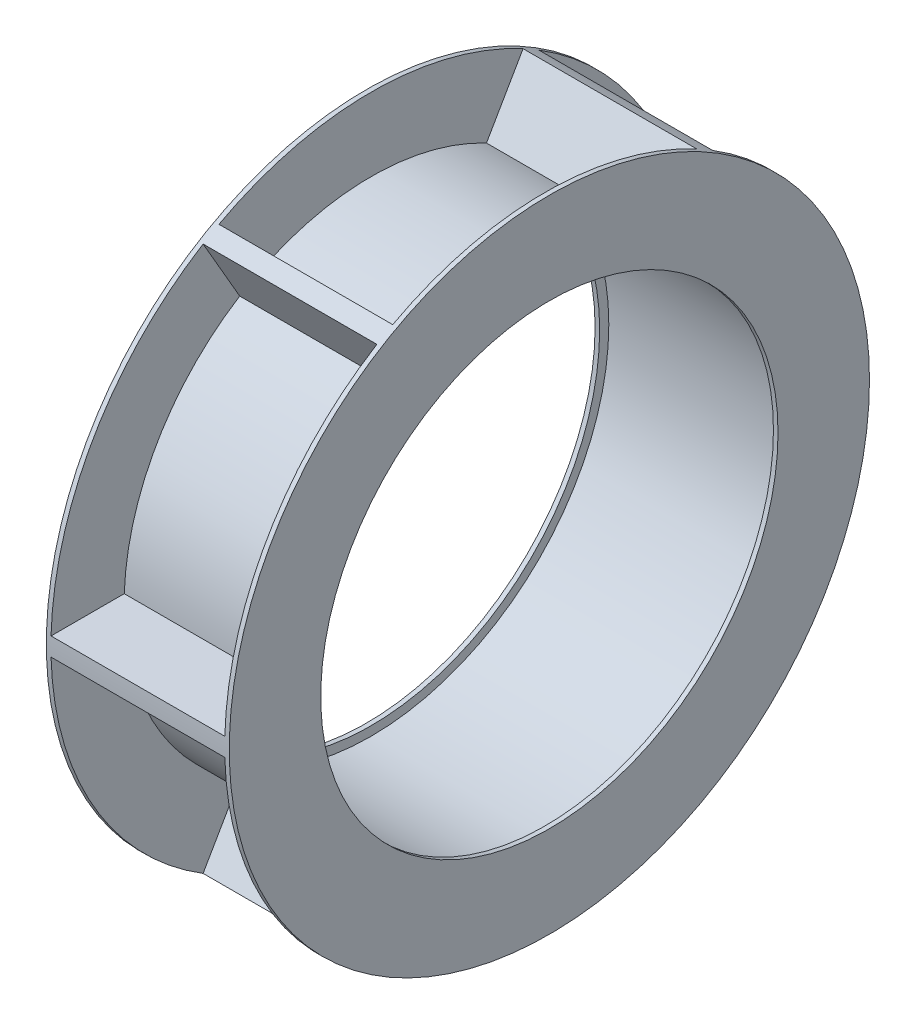
ISO-10303-21;
HEADER;
FILE_DESCRIPTION(('STEP AP214'),'2;1');
FILE_NAME('part.step','',(''),(''),'','','');
FILE_SCHEMA(('AUTOMOTIVE_DESIGN { 1 0 10303 214 1 1 1 1 }'));
ENDSEC;
DATA;
#1=APPLICATION_CONTEXT('core data for automotive mechanical design processes');
#2=APPLICATION_PROTOCOL_DEFINITION('international standard','automotive_design',2000,#1);
#3=PRODUCT_CONTEXT('',#1,'mechanical');
#4=PRODUCT('Part','Part','',(#3));
#5=PRODUCT_RELATED_PRODUCT_CATEGORY('part','',(#4));
#6=PRODUCT_DEFINITION_FORMATION('','',#4);
#7=PRODUCT_DEFINITION_CONTEXT('part definition',#1,'design');
#8=PRODUCT_DEFINITION('design','',#6,#7);
#9=PRODUCT_DEFINITION_SHAPE('','',#8);
#10=(LENGTH_UNIT() NAMED_UNIT(*) SI_UNIT(.MILLI.,.METRE.));
#11=(NAMED_UNIT(*) PLANE_ANGLE_UNIT() SI_UNIT($,.RADIAN.));
#12=(NAMED_UNIT(*) SI_UNIT($,.STERADIAN.) SOLID_ANGLE_UNIT());
#13=UNCERTAINTY_MEASURE_WITH_UNIT(LENGTH_MEASURE(1.E-05),#10,'distance_accuracy_value','');
#14=(GEOMETRIC_REPRESENTATION_CONTEXT(3) GLOBAL_UNCERTAINTY_ASSIGNED_CONTEXT((#13)) GLOBAL_UNIT_ASSIGNED_CONTEXT((#10,
#11,#12)) REPRESENTATION_CONTEXT('',''));
#15=CARTESIAN_POINT('',(0.,0.,0.));
#16=DIRECTION('',(0.,0.,1.));
#17=DIRECTION('',(1.,0.,0.));
#18=AXIS2_PLACEMENT_3D('',#15,#16,#17);
#19=CARTESIAN_POINT('',(-50.,0.,0.));
#20=DIRECTION('',(1.,0.,0.));
#21=DIRECTION('',(0.,0.,-1.));
#22=AXIS2_PLACEMENT_3D('',#19,#20,#21);
#23=CYLINDRICAL_SURFACE('',#22,135.);
#24=DIRECTION('',(1.,0.,0.));
#25=VECTOR('',#24,1.);
#26=CARTESIAN_POINT('',(-50.,114.333214455479,71.7838148350831));
#27=LINE('',#26,#25);
#28=CARTESIAN_POINT('',(-47.5,114.333214455479,71.7838148350831));
#29=VERTEX_POINT('',#28);
#30=CARTESIAN_POINT('',(47.5,114.333214455479,71.7838148350831));
#31=VERTEX_POINT('',#30);
#32=EDGE_CURVE('E451',#29,#31,#27,.T.);
#33=ORIENTED_EDGE('',*,*,#32,.F.);
#34=CARTESIAN_POINT('',(-47.5,0.,0.));
#35=DIRECTION('',(-1.,0.,0.));
#36=DIRECTION('',(0.,0.,1.));
#37=AXIS2_PLACEMENT_3D('',#34,#35,#36);
#38=CIRCLE('',#37,135.);
#39=CARTESIAN_POINT('',(-47.5,5.,134.90737563232));
#40=VERTEX_POINT('',#39);
#41=EDGE_CURVE('E787',#29,#40,#38,.F.);
#42=ORIENTED_EDGE('',*,*,#41,.T.);
#43=DIRECTION('',(1.,0.,0.));
#44=VECTOR('',#43,1.);
#45=CARTESIAN_POINT('',(-50.,5.,134.90737563232));
#46=LINE('',#45,#44);
#47=CARTESIAN_POINT('',(47.5,5.,134.90737563232));
#48=VERTEX_POINT('',#47);
#49=EDGE_CURVE('E483',#40,#48,#46,.T.);
#50=ORIENTED_EDGE('',*,*,#49,.T.);
#51=CARTESIAN_POINT('',(47.5,0.,0.));
#52=DIRECTION('',(1.,0.,0.));
#53=DIRECTION('',(0.,0.,-1.));
#54=AXIS2_PLACEMENT_3D('',#51,#52,#53);
#55=CIRCLE('',#54,135.);
#56=EDGE_CURVE('E746',#48,#31,#55,.F.);
#57=ORIENTED_EDGE('',*,*,#56,.T.);
#58=EDGE_LOOP('',(#33,#42,#50,#57));
#59=FACE_BOUND('',#58,.T.);
#60=ADVANCED_FACE('F239',(#59),#23,.T.);
#61=CARTESIAN_POINT('',(-50.,5.,0.));
#62=DIRECTION('',(0.,-1.,0.));
#63=DIRECTION('',(0.,0.,-1.));
#64=AXIS2_PLACEMENT_3D('',#61,#62,#63);
#65=PLANE('',#64);
#66=DIRECTION('',(0.,0.,-1.));
#67=VECTOR('',#66,1.);
#68=CARTESIAN_POINT('',(-47.5,5.,0.));
#69=LINE('',#68,#67);
#70=CARTESIAN_POINT('',(-47.5,5.,174.928556845359));
#71=VERTEX_POINT('',#70);
#72=EDGE_CURVE('E688',#71,#40,#69,.T.);
#73=ORIENTED_EDGE('',*,*,#72,.F.);
#74=DIRECTION('',(1.,0.,0.));
#75=VECTOR('',#74,1.);
#76=CARTESIAN_POINT('',(-50.,5.,174.928556845359));
#77=LINE('',#76,#75);
#78=CARTESIAN_POINT('',(47.5,5.,174.928556845359));
#79=VERTEX_POINT('',#78);
#80=EDGE_CURVE('E480',#71,#79,#77,.T.);
#81=ORIENTED_EDGE('',*,*,#80,.T.);
#82=DIRECTION('',(0.,0.,1.));
#83=VECTOR('',#82,1.);
#84=CARTESIAN_POINT('',(47.5,5.,0.));
#85=LINE('',#84,#83);
#86=EDGE_CURVE('E750',#48,#79,#85,.T.);
#87=ORIENTED_EDGE('',*,*,#86,.F.);
#88=ORIENTED_EDGE('',*,*,#49,.F.);
#89=EDGE_LOOP('',(#73,#81,#87,#88));
#90=FACE_BOUND('',#89,.T.);
#91=ADVANCED_FACE('F563',(#90),#65,.F.);
#92=CARTESIAN_POINT('',(-50.,-2.50000000000044,4.33012701892296));
#93=DIRECTION('',(0.,-0.499999999999999,0.866025403784439));
#94=DIRECTION('',(0.,-0.866025403784439,-0.499999999999999));
#95=AXIS2_PLACEMENT_3D('',#92,#93,#94);
#96=PLANE('',#95);
#97=DIRECTION('',(1.,0.,0.));
#98=VECTOR('',#97,1.);
#99=CARTESIAN_POINT('',(-50.,148.992574075431,91.7944054416023));
#100=LINE('',#99,#98);
#101=CARTESIAN_POINT('',(-47.5,148.992574075431,91.7944054416023));
#102=VERTEX_POINT('',#101);
#103=CARTESIAN_POINT('',(47.5,148.992574075431,91.7944054416023));
#104=VERTEX_POINT('',#103);
#105=EDGE_CURVE('E484',#102,#104,#100,.T.);
#106=ORIENTED_EDGE('',*,*,#105,.F.);
#107=DIRECTION('',(0.,-0.866025403784439,-0.499999999999999));
#108=VECTOR('',#107,1.);
#109=CARTESIAN_POINT('',(-47.5,-2.50000000000044,4.33012701892296));
#110=LINE('',#109,#108);
#111=EDGE_CURVE('E791',#102,#29,#110,.T.);
#112=ORIENTED_EDGE('',*,*,#111,.T.);
#113=ORIENTED_EDGE('',*,*,#32,.T.);
#114=DIRECTION('',(0.,0.866025403784439,0.499999999999999));
#115=VECTOR('',#114,1.);
#116=CARTESIAN_POINT('',(47.5,-2.50000000000044,4.33012701892296));
#117=LINE('',#116,#115);
#118=EDGE_CURVE('E742',#31,#104,#117,.T.);
#119=ORIENTED_EDGE('',*,*,#118,.T.);
#120=EDGE_LOOP('',(#106,#112,#113,#119));
#121=FACE_BOUND('',#120,.T.);
#122=ADVANCED_FACE('F570',(#121),#96,.T.);
#123=CARTESIAN_POINT('',(-50.,0.,0.));
#124=DIRECTION('',(1.,0.,0.));
#125=DIRECTION('',(0.,0.,-1.));
#126=AXIS2_PLACEMENT_3D('',#123,#124,#125);
#127=CYLINDRICAL_SURFACE('',#126,135.);
#128=DIRECTION('',(1.,0.,0.));
#129=VECTOR('',#128,1.);
#130=CARTESIAN_POINT('',(-50.,-5.,134.90737563232));
#131=LINE('',#130,#129);
#132=CARTESIAN_POINT('',(-47.5,-5.,134.90737563232));
#133=VERTEX_POINT('',#132);
#134=CARTESIAN_POINT('',(47.5,-5.,134.90737563232));
#135=VERTEX_POINT('',#134);
#136=EDGE_CURVE('E754',#133,#135,#131,.T.);
#137=ORIENTED_EDGE('',*,*,#136,.F.);
#138=CARTESIAN_POINT('',(-47.5,0.,0.));
#139=DIRECTION('',(-1.,0.,0.));
#140=DIRECTION('',(0.,0.,1.));
#141=AXIS2_PLACEMENT_3D('',#138,#139,#140);
#142=CIRCLE('',#141,135.);
#143=CARTESIAN_POINT('',(-47.5,-114.333214455479,71.7838148350826));
#144=VERTEX_POINT('',#143);
#145=EDGE_CURVE('E800',#133,#144,#142,.F.);
#146=ORIENTED_EDGE('',*,*,#145,.T.);
#147=DIRECTION('',(1.,0.,0.));
#148=VECTOR('',#147,1.);
#149=CARTESIAN_POINT('',(-50.,-114.333214455479,71.7838148350827));
#150=LINE('',#149,#148);
#151=CARTESIAN_POINT('',(47.5,-114.333214455479,71.7838148350826));
#152=VERTEX_POINT('',#151);
#153=EDGE_CURVE('E467',#144,#152,#150,.T.);
#154=ORIENTED_EDGE('',*,*,#153,.T.);
#155=CARTESIAN_POINT('',(47.5,0.,0.));
#156=DIRECTION('',(1.,0.,0.));
#157=DIRECTION('',(0.,0.,-1.));
#158=AXIS2_PLACEMENT_3D('',#155,#156,#157);
#159=CIRCLE('',#158,135.);
#160=EDGE_CURVE('E734',#152,#135,#159,.F.);
#161=ORIENTED_EDGE('',*,*,#160,.T.);
#162=EDGE_LOOP('',(#137,#146,#154,#161));
#163=FACE_BOUND('',#162,.T.);
#164=ADVANCED_FACE('F576',(#163),#127,.T.);
#165=CARTESIAN_POINT('',(-50.,2.50000000000021,4.33012701892256));
#166=DIRECTION('',(0.,-0.499999999999999,-0.866025403784439));
#167=DIRECTION('',(0.,0.866025403784439,-0.499999999999999));
#168=AXIS2_PLACEMENT_3D('',#165,#166,#167);
#169=PLANE('',#168);
#170=DIRECTION('',(0.,0.866025403784439,-0.499999999999999));
#171=VECTOR('',#170,1.);
#172=CARTESIAN_POINT('',(-47.5,2.50000000000021,4.33012701892256));
#173=LINE('',#172,#171);
#174=CARTESIAN_POINT('',(-47.5,-148.992574075431,91.7944054416019));
#175=VERTEX_POINT('',#174);
#176=EDGE_CURVE('E795',#175,#144,#173,.T.);
#177=ORIENTED_EDGE('',*,*,#176,.F.);
#178=DIRECTION('',(1.,0.,0.));
#179=VECTOR('',#178,1.);
#180=CARTESIAN_POINT('',(-50.,-148.992574075431,91.7944054416019));
#181=LINE('',#180,#179);
#182=CARTESIAN_POINT('',(47.5,-148.992574075431,91.7944054416019));
#183=VERTEX_POINT('',#182);
#184=EDGE_CURVE('E755',#175,#183,#181,.T.);
#185=ORIENTED_EDGE('',*,*,#184,.T.);
#186=DIRECTION('',(0.,-0.866025403784439,0.499999999999999));
#187=VECTOR('',#186,1.);
#188=CARTESIAN_POINT('',(47.5,2.50000000000021,4.33012701892256));
#189=LINE('',#188,#187);
#190=EDGE_CURVE('E738',#152,#183,#189,.T.);
#191=ORIENTED_EDGE('',*,*,#190,.F.);
#192=ORIENTED_EDGE('',*,*,#153,.F.);
#193=EDGE_LOOP('',(#177,#185,#191,#192));
#194=FACE_BOUND('',#193,.T.);
#195=ADVANCED_FACE('F627',(#194),#169,.F.);
#196=CARTESIAN_POINT('',(-50.,-5.,0.));
#197=DIRECTION('',(0.,-1.,0.));
#198=DIRECTION('',(0.,0.,-1.));
#199=AXIS2_PLACEMENT_3D('',#196,#197,#198);
#200=PLANE('',#199);
#201=DIRECTION('',(1.,0.,0.));
#202=VECTOR('',#201,1.);
#203=CARTESIAN_POINT('',(-50.,-5.,174.928556845359));
#204=LINE('',#203,#202);
#205=CARTESIAN_POINT('',(-47.5,-5.,174.928556845359));
#206=VERTEX_POINT('',#205);
#207=CARTESIAN_POINT('',(47.5,-5.,174.928556845359));
#208=VERTEX_POINT('',#207);
#209=EDGE_CURVE('E438',#206,#208,#204,.T.);
#210=ORIENTED_EDGE('',*,*,#209,.F.);
#211=DIRECTION('',(0.,0.,-1.));
#212=VECTOR('',#211,1.);
#213=CARTESIAN_POINT('',(-47.5,-5.,0.));
#214=LINE('',#213,#212);
#215=EDGE_CURVE('E804',#206,#133,#214,.T.);
#216=ORIENTED_EDGE('',*,*,#215,.T.);
#217=ORIENTED_EDGE('',*,*,#136,.T.);
#218=DIRECTION('',(0.,0.,1.));
#219=VECTOR('',#218,1.);
#220=CARTESIAN_POINT('',(47.5,-5.,0.));
#221=LINE('',#220,#219);
#222=EDGE_CURVE('E730',#135,#208,#221,.T.);
#223=ORIENTED_EDGE('',*,*,#222,.T.);
#224=EDGE_LOOP('',(#210,#216,#217,#223));
#225=FACE_BOUND('',#224,.T.);
#226=ADVANCED_FACE('F583',(#225),#200,.T.);
#227=CARTESIAN_POINT('',(-50.,0.,0.));
#228=DIRECTION('',(1.,0.,0.));
#229=DIRECTION('',(0.,0.,-1.));
#230=AXIS2_PLACEMENT_3D('',#227,#228,#229);
#231=CYLINDRICAL_SURFACE('',#230,135.);
#232=DIRECTION('',(1.,0.,0.));
#233=VECTOR('',#232,1.);
#234=CARTESIAN_POINT('',(-50.,-114.333214455479,-71.7838148350824));
#235=LINE('',#234,#233);
#236=CARTESIAN_POINT('',(-47.5,-114.333214455479,-71.7838148350824));
#237=VERTEX_POINT('',#236);
#238=CARTESIAN_POINT('',(47.5,-114.333214455479,-71.7838148350824));
#239=VERTEX_POINT('',#238);
#240=EDGE_CURVE('E463',#237,#239,#235,.T.);
#241=ORIENTED_EDGE('',*,*,#240,.F.);
#242=CARTESIAN_POINT('',(-47.5,0.,0.));
#243=DIRECTION('',(-1.,0.,0.));
#244=DIRECTION('',(0.,0.,1.));
#245=AXIS2_PLACEMENT_3D('',#242,#243,#244);
#246=CIRCLE('',#245,135.);
#247=CARTESIAN_POINT('',(-47.5,-4.99999999999928,-134.90737563232));
#248=VERTEX_POINT('',#247);
#249=EDGE_CURVE('E810',#237,#248,#246,.F.);
#250=ORIENTED_EDGE('',*,*,#249,.T.);
#251=DIRECTION('',(1.,0.,0.));
#252=VECTOR('',#251,1.);
#253=CARTESIAN_POINT('',(-50.,-4.99999999999928,-134.90737563232));
#254=LINE('',#253,#252);
#255=CARTESIAN_POINT('',(47.5,-4.99999999999928,-134.90737563232));
#256=VERTEX_POINT('',#255);
#257=EDGE_CURVE('E442',#248,#256,#254,.T.);
#258=ORIENTED_EDGE('',*,*,#257,.T.);
#259=CARTESIAN_POINT('',(47.5,0.,0.));
#260=DIRECTION('',(1.,0.,0.));
#261=DIRECTION('',(0.,0.,-1.));
#262=AXIS2_PLACEMENT_3D('',#259,#260,#261);
#263=CIRCLE('',#262,135.);
#264=EDGE_CURVE('E722',#256,#239,#263,.F.);
#265=ORIENTED_EDGE('',*,*,#264,.T.);
#266=EDGE_LOOP('',(#241,#250,#258,#265));
#267=FACE_BOUND('',#266,.T.);
#268=ADVANCED_FACE('F579',(#267),#231,.T.);
#269=CARTESIAN_POINT('',(-50.,-4.99999999999929,0.));
#270=DIRECTION('',(0.,1.,0.));
#271=DIRECTION('',(0.,0.,1.));
#272=AXIS2_PLACEMENT_3D('',#269,#270,#271);
#273=PLANE('',#272);
#274=DIRECTION('',(0.,0.,1.));
#275=VECTOR('',#274,1.);
#276=CARTESIAN_POINT('',(-47.5,-4.99999999999929,0.));
#277=LINE('',#276,#275);
#278=CARTESIAN_POINT('',(-47.5,-4.99999999999927,-174.928556845359));
#279=VERTEX_POINT('',#278);
#280=EDGE_CURVE('E807',#279,#248,#277,.T.);
#281=ORIENTED_EDGE('',*,*,#280,.F.);
#282=DIRECTION('',(1.,0.,0.));
#283=VECTOR('',#282,1.);
#284=CARTESIAN_POINT('',(-50.,-4.99999999999927,-174.928556845359));
#285=LINE('',#284,#283);
#286=CARTESIAN_POINT('',(47.5,-4.99999999999927,-174.928556845359));
#287=VERTEX_POINT('',#286);
#288=EDGE_CURVE('E470',#279,#287,#285,.T.);
#289=ORIENTED_EDGE('',*,*,#288,.T.);
#290=DIRECTION('',(0.,0.,-1.));
#291=VECTOR('',#290,1.);
#292=CARTESIAN_POINT('',(47.5,-4.99999999999929,0.));
#293=LINE('',#292,#291);
#294=EDGE_CURVE('E726',#256,#287,#293,.T.);
#295=ORIENTED_EDGE('',*,*,#294,.F.);
#296=ORIENTED_EDGE('',*,*,#257,.F.);
#297=EDGE_LOOP('',(#281,#289,#295,#296));
#298=FACE_BOUND('',#297,.T.);
#299=ADVANCED_FACE('F582',(#298),#273,.F.);
#300=CARTESIAN_POINT('',(-50.,2.49999999999997,-4.33012701892213));
#301=DIRECTION('',(0.,0.500000000000001,-0.866025403784438));
#302=DIRECTION('',(0.,0.866025403784438,0.500000000000001));
#303=AXIS2_PLACEMENT_3D('',#300,#301,#302);
#304=PLANE('',#303);
#305=DIRECTION('',(1.,0.,0.));
#306=VECTOR('',#305,1.);
#307=CARTESIAN_POINT('',(-50.,-148.992574075431,-91.7944054416017));
#308=LINE('',#307,#306);
#309=CARTESIAN_POINT('',(-47.5,-148.992574075431,-91.7944054416017));
#310=VERTEX_POINT('',#309);
#311=CARTESIAN_POINT('',(47.5,-148.992574075431,-91.7944054416017));
#312=VERTEX_POINT('',#311);
#313=EDGE_CURVE('E473',#310,#312,#308,.T.);
#314=ORIENTED_EDGE('',*,*,#313,.F.);
#315=DIRECTION('',(0.,0.866025403784438,0.500000000000001));
#316=VECTOR('',#315,1.);
#317=CARTESIAN_POINT('',(-47.5,2.49999999999997,-4.33012701892213));
#318=LINE('',#317,#316);
#319=EDGE_CURVE('E814',#310,#237,#318,.T.);
#320=ORIENTED_EDGE('',*,*,#319,.T.);
#321=ORIENTED_EDGE('',*,*,#240,.T.);
#322=DIRECTION('',(0.,-0.866025403784438,-0.500000000000001));
#323=VECTOR('',#322,1.);
#324=CARTESIAN_POINT('',(47.5,2.49999999999997,-4.33012701892213));
#325=LINE('',#324,#323);
#326=EDGE_CURVE('E718',#239,#312,#325,.T.);
#327=ORIENTED_EDGE('',*,*,#326,.T.);
#328=EDGE_LOOP('',(#314,#320,#321,#327));
#329=FACE_BOUND('',#328,.T.);
#330=ADVANCED_FACE('F585',(#329),#304,.T.);
#331=CARTESIAN_POINT('',(-50.,0.,0.));
#332=DIRECTION('',(1.,0.,0.));
#333=DIRECTION('',(0.,0.,-1.));
#334=AXIS2_PLACEMENT_3D('',#331,#332,#333);
#335=CYLINDRICAL_SURFACE('',#334,135.);
#336=DIRECTION('',(1.,0.,0.));
#337=VECTOR('',#336,1.);
#338=CARTESIAN_POINT('',(-50.,-119.333214455479,63.1235607972383));
#339=LINE('',#338,#337);
#340=CARTESIAN_POINT('',(-47.5,-119.333214455479,63.1235607972383));
#341=VERTEX_POINT('',#340);
#342=CARTESIAN_POINT('',(47.5,-119.333214455479,63.1235607972383));
#343=VERTEX_POINT('',#342);
#344=EDGE_CURVE('E464',#341,#343,#339,.T.);
#345=ORIENTED_EDGE('',*,*,#344,.F.);
#346=CARTESIAN_POINT('',(-47.5,0.,0.));
#347=DIRECTION('',(-1.,0.,0.));
#348=DIRECTION('',(0.,0.,1.));
#349=AXIS2_PLACEMENT_3D('',#346,#347,#348);
#350=CIRCLE('',#349,135.);
#351=CARTESIAN_POINT('',(-47.5,-119.333214455479,-63.1235607972381));
#352=VERTEX_POINT('',#351);
#353=EDGE_CURVE('E821',#341,#352,#350,.F.);
#354=ORIENTED_EDGE('',*,*,#353,.T.);
#355=DIRECTION('',(1.,0.,0.));
#356=VECTOR('',#355,1.);
#357=CARTESIAN_POINT('',(-50.,-119.333214455479,-63.1235607972381));
#358=LINE('',#357,#356);
#359=CARTESIAN_POINT('',(47.5,-119.333214455479,-63.1235607972381));
#360=VERTEX_POINT('',#359);
#361=EDGE_CURVE('E459',#352,#360,#358,.T.);
#362=ORIENTED_EDGE('',*,*,#361,.T.);
#363=CARTESIAN_POINT('',(47.5,0.,0.));
#364=DIRECTION('',(1.,0.,0.));
#365=DIRECTION('',(0.,0.,-1.));
#366=AXIS2_PLACEMENT_3D('',#363,#364,#365);
#367=CIRCLE('',#366,135.);
#368=EDGE_CURVE('E710',#360,#343,#367,.F.);
#369=ORIENTED_EDGE('',*,*,#368,.T.);
#370=EDGE_LOOP('',(#345,#354,#362,#369));
#371=FACE_BOUND('',#370,.T.);
#372=ADVANCED_FACE('F588',(#371),#335,.T.);
#373=CARTESIAN_POINT('',(-50.,-2.50000000000003,4.33012701892223));
#374=DIRECTION('',(0.,0.500000000000001,-0.866025403784438));
#375=DIRECTION('',(0.,0.866025403784438,0.500000000000001));
#376=AXIS2_PLACEMENT_3D('',#373,#374,#375);
#377=PLANE('',#376);
#378=DIRECTION('',(0.,0.866025403784438,0.500000000000001));
#379=VECTOR('',#378,1.);
#380=CARTESIAN_POINT('',(-47.5,-2.50000000000003,4.33012701892223));
#381=LINE('',#380,#379);
#382=CARTESIAN_POINT('',(-47.5,-153.992574075431,-83.1341514037574));
#383=VERTEX_POINT('',#382);
#384=EDGE_CURVE('E818',#383,#352,#381,.T.);
#385=ORIENTED_EDGE('',*,*,#384,.F.);
#386=DIRECTION('',(1.,0.,0.));
#387=VECTOR('',#386,1.);
#388=CARTESIAN_POINT('',(-50.,-153.992574075431,-83.1341514037574));
#389=LINE('',#388,#387);
#390=CARTESIAN_POINT('',(47.5,-153.992574075431,-83.1341514037574));
#391=VERTEX_POINT('',#390);
#392=EDGE_CURVE('E456',#383,#391,#389,.T.);
#393=ORIENTED_EDGE('',*,*,#392,.T.);
#394=DIRECTION('',(0.,-0.866025403784438,-0.500000000000001));
#395=VECTOR('',#394,1.);
#396=CARTESIAN_POINT('',(47.5,-2.50000000000003,4.33012701892223));
#397=LINE('',#396,#395);
#398=EDGE_CURVE('E714',#360,#391,#397,.T.);
#399=ORIENTED_EDGE('',*,*,#398,.F.);
#400=ORIENTED_EDGE('',*,*,#361,.F.);
#401=EDGE_LOOP('',(#385,#393,#399,#400));
#402=FACE_BOUND('',#401,.T.);
#403=ADVANCED_FACE('F595',(#402),#377,.F.);
#404=CARTESIAN_POINT('',(-50.,-2.4999999999998,-4.33012701892186));
#405=DIRECTION('',(0.,-0.499999999999999,-0.866025403784439));
#406=DIRECTION('',(0.,0.866025403784439,-0.499999999999999));
#407=AXIS2_PLACEMENT_3D('',#404,#405,#406);
#408=PLANE('',#407);
#409=DIRECTION('',(1.,0.,0.));
#410=VECTOR('',#409,1.);
#411=CARTESIAN_POINT('',(-50.,-153.992574075431,83.1341514037575));
#412=LINE('',#411,#410);
#413=CARTESIAN_POINT('',(-47.5,-153.992574075431,83.1341514037575));
#414=VERTEX_POINT('',#413);
#415=CARTESIAN_POINT('',(47.5,-153.992574075431,83.1341514037575));
#416=VERTEX_POINT('',#415);
#417=EDGE_CURVE('E460',#414,#416,#412,.T.);
#418=ORIENTED_EDGE('',*,*,#417,.F.);
#419=DIRECTION('',(0.,0.866025403784439,-0.499999999999999));
#420=VECTOR('',#419,1.);
#421=CARTESIAN_POINT('',(-47.5,-2.4999999999998,-4.33012701892186));
#422=LINE('',#421,#420);
#423=EDGE_CURVE('E668',#414,#341,#422,.T.);
#424=ORIENTED_EDGE('',*,*,#423,.T.);
#425=ORIENTED_EDGE('',*,*,#344,.T.);
#426=DIRECTION('',(0.,-0.866025403784439,0.499999999999999));
#427=VECTOR('',#426,1.);
#428=CARTESIAN_POINT('',(47.5,-2.4999999999998,-4.33012701892186));
#429=LINE('',#428,#427);
#430=EDGE_CURVE('E706',#343,#416,#429,.T.);
#431=ORIENTED_EDGE('',*,*,#430,.T.);
#432=EDGE_LOOP('',(#418,#424,#425,#431));
#433=FACE_BOUND('',#432,.T.);
#434=ADVANCED_FACE('F597',(#433),#408,.T.);
#435=CARTESIAN_POINT('',(-50.,0.,0.));
#436=DIRECTION('',(1.,0.,0.));
#437=DIRECTION('',(0.,0.,-1.));
#438=AXIS2_PLACEMENT_3D('',#435,#436,#437);
#439=CYLINDRICAL_SURFACE('',#438,135.);
#440=DIRECTION('',(1.,0.,0.));
#441=VECTOR('',#440,1.);
#442=CARTESIAN_POINT('',(-50.,119.33321445548,-63.123560797237));
#443=LINE('',#442,#441);
#444=CARTESIAN_POINT('',(-47.5,119.33321445548,-63.123560797237));
#445=VERTEX_POINT('',#444);
#446=CARTESIAN_POINT('',(47.5,119.33321445548,-63.123560797237));
#447=VERTEX_POINT('',#446);
#448=EDGE_CURVE('E433',#445,#447,#443,.T.);
#449=ORIENTED_EDGE('',*,*,#448,.F.);
#450=CARTESIAN_POINT('',(-47.5,0.,0.));
#451=DIRECTION('',(-1.,0.,0.));
#452=DIRECTION('',(0.,0.,1.));
#453=AXIS2_PLACEMENT_3D('',#450,#451,#452);
#454=CIRCLE('',#453,135.);
#455=CARTESIAN_POINT('',(-47.5,119.333214455479,63.1235607972387));
#456=VERTEX_POINT('',#455);
#457=EDGE_CURVE('E669',#445,#456,#454,.F.);
#458=ORIENTED_EDGE('',*,*,#457,.T.);
#459=DIRECTION('',(1.,0.,0.));
#460=VECTOR('',#459,1.);
#461=CARTESIAN_POINT('',(-50.,119.333214455479,63.1235607972387));
#462=LINE('',#461,#460);
#463=CARTESIAN_POINT('',(47.5,119.333214455479,63.1235607972387));
#464=VERTEX_POINT('',#463);
#465=EDGE_CURVE('E447',#456,#464,#462,.T.);
#466=ORIENTED_EDGE('',*,*,#465,.T.);
#467=CARTESIAN_POINT('',(47.5,0.,0.));
#468=DIRECTION('',(1.,0.,0.));
#469=DIRECTION('',(0.,0.,-1.));
#470=AXIS2_PLACEMENT_3D('',#467,#468,#469);
#471=CIRCLE('',#470,135.);
#472=EDGE_CURVE('E699',#464,#447,#471,.F.);
#473=ORIENTED_EDGE('',*,*,#472,.T.);
#474=EDGE_LOOP('',(#449,#458,#466,#473));
#475=FACE_BOUND('',#474,.T.);
#476=ADVANCED_FACE('F600',(#475),#439,.T.);
#477=CARTESIAN_POINT('',(-50.,2.4999999999996,-4.3301270189215));
#478=DIRECTION('',(0.,-0.5,0.866025403784439));
#479=DIRECTION('',(0.,-0.866025403784439,-0.5));
#480=AXIS2_PLACEMENT_3D('',#477,#478,#479);
#481=PLANE('',#480);
#482=DIRECTION('',(0.,-0.866025403784439,-0.5));
#483=VECTOR('',#482,1.);
#484=CARTESIAN_POINT('',(-47.5,2.4999999999996,-4.3301270189215));
#485=LINE('',#484,#483);
#486=CARTESIAN_POINT('',(-47.5,153.992574075431,83.134151403758));
#487=VERTEX_POINT('',#486);
#488=EDGE_CURVE('E659',#487,#456,#485,.T.);
#489=ORIENTED_EDGE('',*,*,#488,.F.);
#490=DIRECTION('',(1.,0.,0.));
#491=VECTOR('',#490,1.);
#492=CARTESIAN_POINT('',(-50.,153.992574075431,83.1341514037579));
#493=LINE('',#492,#491);
#494=CARTESIAN_POINT('',(47.5,153.992574075431,83.1341514037579));
#495=VERTEX_POINT('',#494);
#496=EDGE_CURVE('E444',#487,#495,#493,.T.);
#497=ORIENTED_EDGE('',*,*,#496,.T.);
#498=DIRECTION('',(0.,0.866025403784439,0.5));
#499=VECTOR('',#498,1.);
#500=CARTESIAN_POINT('',(47.5,2.4999999999996,-4.3301270189215));
#501=LINE('',#500,#499);
#502=EDGE_CURVE('E703',#464,#495,#501,.T.);
#503=ORIENTED_EDGE('',*,*,#502,.F.);
#504=ORIENTED_EDGE('',*,*,#465,.F.);
#505=EDGE_LOOP('',(#489,#497,#503,#504));
#506=FACE_BOUND('',#505,.T.);
#507=ADVANCED_FACE('F607',(#506),#481,.F.);
#508=CARTESIAN_POINT('',(-50.,2.50000000000056,4.33012701892317));
#509=DIRECTION('',(0.,0.5,0.866025403784439));
#510=DIRECTION('',(0.,-0.866025403784439,0.5));
#511=AXIS2_PLACEMENT_3D('',#508,#509,#510);
#512=PLANE('',#511);
#513=DIRECTION('',(1.,0.,0.));
#514=VECTOR('',#513,1.);
#515=CARTESIAN_POINT('',(-50.,153.992574075432,-83.1341514037563));
#516=LINE('',#515,#514);
#517=CARTESIAN_POINT('',(-47.5,153.992574075432,-83.1341514037563));
#518=VERTEX_POINT('',#517);
#519=CARTESIAN_POINT('',(47.5,153.992574075432,-83.1341514037563));
#520=VERTEX_POINT('',#519);
#521=EDGE_CURVE('E448',#518,#520,#516,.T.);
#522=ORIENTED_EDGE('',*,*,#521,.F.);
#523=DIRECTION('',(0.,-0.866025403784439,0.5));
#524=VECTOR('',#523,1.);
#525=CARTESIAN_POINT('',(-47.5,2.50000000000056,4.33012701892317));
#526=LINE('',#525,#524);
#527=EDGE_CURVE('E421',#518,#445,#526,.T.);
#528=ORIENTED_EDGE('',*,*,#527,.T.);
#529=ORIENTED_EDGE('',*,*,#448,.T.);
#530=DIRECTION('',(0.,0.866025403784439,-0.5));
#531=VECTOR('',#530,1.);
#532=CARTESIAN_POINT('',(47.5,2.50000000000056,4.33012701892317));
#533=LINE('',#532,#531);
#534=EDGE_CURVE('E696',#447,#520,#533,.T.);
#535=ORIENTED_EDGE('',*,*,#534,.T.);
#536=EDGE_LOOP('',(#522,#528,#529,#535));
#537=FACE_BOUND('',#536,.T.);
#538=ADVANCED_FACE('F609',(#537),#512,.T.);
#539=CARTESIAN_POINT('',(-50.,0.,0.));
#540=DIRECTION('',(1.,0.,0.));
#541=DIRECTION('',(0.,0.,-1.));
#542=AXIS2_PLACEMENT_3D('',#539,#540,#541);
#543=CYLINDRICAL_SURFACE('',#542,135.);
#544=DIRECTION('',(1.,0.,0.));
#545=VECTOR('',#544,1.);
#546=CARTESIAN_POINT('',(-50.,5.00000000000072,-134.90737563232));
#547=LINE('',#546,#545);
#548=CARTESIAN_POINT('',(-47.5,5.00000000000072,-134.90737563232));
#549=VERTEX_POINT('',#548);
#550=CARTESIAN_POINT('',(47.5,5.00000000000072,-134.90737563232));
#551=VERTEX_POINT('',#550);
#552=EDGE_CURVE('E435',#549,#551,#547,.T.);
#553=ORIENTED_EDGE('',*,*,#552,.F.);
#554=CARTESIAN_POINT('',(-47.5,0.,0.));
#555=DIRECTION('',(-1.,0.,0.));
#556=DIRECTION('',(0.,0.,1.));
#557=AXIS2_PLACEMENT_3D('',#554,#555,#556);
#558=CIRCLE('',#557,135.);
#559=CARTESIAN_POINT('',(-47.5,114.33321445548,-71.7838148350815));
#560=VERTEX_POINT('',#559);
#561=EDGE_CURVE('E422',#549,#560,#558,.F.);
#562=ORIENTED_EDGE('',*,*,#561,.T.);
#563=DIRECTION('',(1.,0.,0.));
#564=VECTOR('',#563,1.);
#565=CARTESIAN_POINT('',(-50.,114.33321445548,-71.7838148350815));
#566=LINE('',#565,#564);
#567=CARTESIAN_POINT('',(47.5,114.33321445548,-71.7838148350815));
#568=VERTEX_POINT('',#567);
#569=EDGE_CURVE('E419',#560,#568,#566,.T.);
#570=ORIENTED_EDGE('',*,*,#569,.T.);
#571=CARTESIAN_POINT('',(47.5,0.,0.));
#572=DIRECTION('',(1.,0.,0.));
#573=DIRECTION('',(0.,0.,-1.));
#574=AXIS2_PLACEMENT_3D('',#571,#572,#573);
#575=CIRCLE('',#574,135.);
#576=EDGE_CURVE('E682',#568,#551,#575,.F.);
#577=ORIENTED_EDGE('',*,*,#576,.T.);
#578=EDGE_LOOP('',(#553,#562,#570,#577));
#579=FACE_BOUND('',#578,.T.);
#580=ADVANCED_FACE('F612',(#579),#543,.T.);
#581=CARTESIAN_POINT('',(-50.,-2.49999999999943,-4.3301270189212));
#582=DIRECTION('',(0.,0.5,0.866025403784438));
#583=DIRECTION('',(0.,-0.866025403784439,0.5));
#584=AXIS2_PLACEMENT_3D('',#581,#582,#583);
#585=PLANE('',#584);
#586=DIRECTION('',(0.,-0.866025403784439,0.5));
#587=VECTOR('',#586,1.);
#588=CARTESIAN_POINT('',(-47.5,-2.49999999999943,-4.3301270189212));
#589=LINE('',#588,#587);
#590=CARTESIAN_POINT('',(-47.5,148.992574075432,-91.7944054416007));
#591=VERTEX_POINT('',#590);
#592=EDGE_CURVE('E403',#591,#560,#589,.T.);
#593=ORIENTED_EDGE('',*,*,#592,.F.);
#594=DIRECTION('',(1.,0.,0.));
#595=VECTOR('',#594,1.);
#596=CARTESIAN_POINT('',(-50.,148.992574075432,-91.7944054416008));
#597=LINE('',#596,#595);
#598=CARTESIAN_POINT('',(47.5,148.992574075432,-91.7944054416008));
#599=VERTEX_POINT('',#598);
#600=EDGE_CURVE('E417',#591,#599,#597,.T.);
#601=ORIENTED_EDGE('',*,*,#600,.T.);
#602=DIRECTION('',(0.,0.866025403784439,-0.5));
#603=VECTOR('',#602,1.);
#604=CARTESIAN_POINT('',(47.5,-2.49999999999943,-4.3301270189212));
#605=LINE('',#604,#603);
#606=EDGE_CURVE('E693',#568,#599,#605,.T.);
#607=ORIENTED_EDGE('',*,*,#606,.F.);
#608=ORIENTED_EDGE('',*,*,#569,.F.);
#609=EDGE_LOOP('',(#593,#601,#607,#608));
#610=FACE_BOUND('',#609,.T.);
#611=ADVANCED_FACE('F415',(#610),#585,.F.);
#612=CARTESIAN_POINT('',(-50.,5.00000000000071,0.));
#613=DIRECTION('',(0.,1.,0.));
#614=DIRECTION('',(0.,0.,1.));
#615=AXIS2_PLACEMENT_3D('',#612,#613,#614);
#616=PLANE('',#615);
#617=DIRECTION('',(1.,0.,0.));
#618=VECTOR('',#617,1.);
#619=CARTESIAN_POINT('',(-50.,5.00000000000073,-174.928556845359));
#620=LINE('',#619,#618);
#621=CARTESIAN_POINT('',(-47.5,5.00000000000073,-174.928556845359));
#622=VERTEX_POINT('',#621);
#623=CARTESIAN_POINT('',(47.5,5.00000000000073,-174.928556845359));
#624=VERTEX_POINT('',#623);
#625=EDGE_CURVE('E429',#622,#624,#620,.T.);
#626=ORIENTED_EDGE('',*,*,#625,.F.);
#627=DIRECTION('',(0.,0.,1.));
#628=VECTOR('',#627,1.);
#629=CARTESIAN_POINT('',(-47.5,5.00000000000071,0.));
#630=LINE('',#629,#628);
#631=EDGE_CURVE('E406',#622,#549,#630,.T.);
#632=ORIENTED_EDGE('',*,*,#631,.T.);
#633=ORIENTED_EDGE('',*,*,#552,.T.);
#634=DIRECTION('',(0.,0.,-1.));
#635=VECTOR('',#634,1.);
#636=CARTESIAN_POINT('',(47.5,5.00000000000071,0.));
#637=LINE('',#636,#635);
#638=EDGE_CURVE('E12',#551,#624,#637,.T.);
#639=ORIENTED_EDGE('',*,*,#638,.T.);
#640=EDGE_LOOP('',(#626,#632,#633,#639));
#641=FACE_BOUND('',#640,.T.);
#642=ADVANCED_FACE('F532',(#641),#616,.T.);
#643=CARTESIAN_POINT('',(50.,0.,0.));
#644=DIRECTION('',(-1.,0.,0.));
#645=DIRECTION('',(0.,0.,1.));
#646=AXIS2_PLACEMENT_3D('',#643,#644,#645);
#647=CYLINDRICAL_SURFACE('',#646,125.);
#648=CARTESIAN_POINT('',(-50.,0.,0.));
#649=DIRECTION('',(1.,0.,0.));
#650=DIRECTION('',(0.,0.,-1.));
#651=AXIS2_PLACEMENT_3D('',#648,#649,#650);
#652=CIRCLE('',#651,125.);
#653=CARTESIAN_POINT('',(-50.,0.,-125.));
#654=VERTEX_POINT('',#653);
#655=EDGE_CURVE('E504',#654,#654,#652,.T.);
#656=ORIENTED_EDGE('',*,*,#655,.F.);
#657=EDGE_LOOP('',(#656));
#658=FACE_BOUND('',#657,.T.);
#659=CARTESIAN_POINT('',(-47.5,0.,0.));
#660=DIRECTION('',(1.,0.,0.));
#661=DIRECTION('',(0.,0.,-1.));
#662=AXIS2_PLACEMENT_3D('',#659,#660,#661);
#663=CIRCLE('',#662,125.);
#664=CARTESIAN_POINT('',(-47.5,0.,-125.));
#665=VERTEX_POINT('',#664);
#666=EDGE_CURVE('E492',#665,#665,#663,.T.);
#667=ORIENTED_EDGE('',*,*,#666,.T.);
#668=EDGE_LOOP('',(#667));
#669=FACE_BOUND('',#668,.T.);
#670=ADVANCED_FACE('F529',(#658,#669),#647,.F.);
#671=CARTESIAN_POINT('',(50.,0.,0.));
#672=DIRECTION('',(1.,0.,0.));
#673=DIRECTION('',(0.,0.,-1.));
#674=AXIS2_PLACEMENT_3D('',#671,#672,#673);
#675=PLANE('',#674);
#676=CARTESIAN_POINT('',(50.,0.,0.));
#677=DIRECTION('',(1.,0.,0.));
#678=DIRECTION('',(0.,0.,-1.));
#679=AXIS2_PLACEMENT_3D('',#676,#677,#678);
#680=CIRCLE('',#679,175.);
#681=CARTESIAN_POINT('',(50.,0.,-175.));
#682=VERTEX_POINT('',#681);
#683=EDGE_CURVE('E248',#682,#682,#680,.T.);
#684=ORIENTED_EDGE('',*,*,#683,.T.);
#685=EDGE_LOOP('',(#684));
#686=FACE_BOUND('',#685,.T.);
#687=CARTESIAN_POINT('',(50.,0.,0.));
#688=DIRECTION('',(1.,0.,0.));
#689=DIRECTION('',(0.,0.,-1.));
#690=AXIS2_PLACEMENT_3D('',#687,#688,#689);
#691=CIRCLE('',#690,125.);
#692=CARTESIAN_POINT('',(50.,0.,-125.));
#693=VERTEX_POINT('',#692);
#694=EDGE_CURVE('E508',#693,#693,#691,.T.);
#695=ORIENTED_EDGE('',*,*,#694,.F.);
#696=EDGE_LOOP('',(#695));
#697=FACE_BOUND('',#696,.T.);
#698=ADVANCED_FACE('F526',(#686,#697),#675,.T.);
#699=CARTESIAN_POINT('',(-50.,0.,0.));
#700=DIRECTION('',(1.,0.,0.));
#701=DIRECTION('',(0.,0.,-1.));
#702=AXIS2_PLACEMENT_3D('',#699,#700,#701);
#703=PLANE('',#702);
#704=CARTESIAN_POINT('',(-50.,0.,0.));
#705=DIRECTION('',(1.,0.,0.));
#706=DIRECTION('',(0.,0.,-1.));
#707=AXIS2_PLACEMENT_3D('',#704,#705,#706);
#708=CIRCLE('',#707,175.);
#709=CARTESIAN_POINT('',(-50.,0.,-175.));
#710=VERTEX_POINT('',#709);
#711=EDGE_CURVE('E512',#710,#710,#708,.T.);
#712=ORIENTED_EDGE('',*,*,#711,.F.);
#713=EDGE_LOOP('',(#712));
#714=FACE_BOUND('',#713,.T.);
#715=ORIENTED_EDGE('',*,*,#655,.T.);
#716=EDGE_LOOP('',(#715));
#717=FACE_BOUND('',#716,.T.);
#718=ADVANCED_FACE('F523',(#714,#717),#703,.F.);
#719=CARTESIAN_POINT('',(50.,0.,0.));
#720=DIRECTION('',(-1.,0.,0.));
#721=DIRECTION('',(0.,0.,1.));
#722=AXIS2_PLACEMENT_3D('',#719,#720,#721);
#723=CYLINDRICAL_SURFACE('',#722,175.);
#724=ORIENTED_EDGE('',*,*,#80,.F.);
#725=CARTESIAN_POINT('',(-47.5,0.,0.));
#726=DIRECTION('',(1.,0.,0.));
#727=DIRECTION('',(0.,0.,-1.));
#728=AXIS2_PLACEMENT_3D('',#725,#726,#727);
#729=CIRCLE('',#728,175.);
#730=EDGE_CURVE('E255',#102,#71,#729,.T.);
#731=ORIENTED_EDGE('',*,*,#730,.F.);
#732=ORIENTED_EDGE('',*,*,#105,.T.);
#733=CARTESIAN_POINT('',(47.5,0.,0.));
#734=DIRECTION('',(1.,0.,0.));
#735=DIRECTION('',(0.,0.,-1.));
#736=AXIS2_PLACEMENT_3D('',#733,#734,#735);
#737=CIRCLE('',#736,175.);
#738=EDGE_CURVE('E678',#104,#79,#737,.T.);
#739=ORIENTED_EDGE('',*,*,#738,.T.);
#740=EDGE_LOOP('',(#724,#731,#732,#739));
#741=FACE_BOUND('',#740,.T.);
#742=ORIENTED_EDGE('',*,*,#184,.F.);
#743=EDGE_CURVE('E770',#206,#175,#729,.T.);
#744=ORIENTED_EDGE('',*,*,#743,.F.);
#745=ORIENTED_EDGE('',*,*,#209,.T.);
#746=EDGE_CURVE('E685',#208,#183,#737,.T.);
#747=ORIENTED_EDGE('',*,*,#746,.T.);
#748=EDGE_LOOP('',(#742,#744,#745,#747));
#749=FACE_BOUND('',#748,.T.);
#750=ORIENTED_EDGE('',*,*,#288,.F.);
#751=EDGE_CURVE('E412',#310,#279,#729,.T.);
#752=ORIENTED_EDGE('',*,*,#751,.F.);
#753=ORIENTED_EDGE('',*,*,#313,.T.);
#754=EDGE_CURVE('E683',#312,#287,#737,.T.);
#755=ORIENTED_EDGE('',*,*,#754,.T.);
#756=EDGE_LOOP('',(#750,#752,#753,#755));
#757=FACE_BOUND('',#756,.T.);
#758=ORIENTED_EDGE('',*,*,#392,.F.);
#759=EDGE_CURVE('E841',#414,#383,#729,.T.);
#760=ORIENTED_EDGE('',*,*,#759,.F.);
#761=ORIENTED_EDGE('',*,*,#417,.T.);
#762=EDGE_CURVE('E776',#416,#391,#737,.T.);
#763=ORIENTED_EDGE('',*,*,#762,.T.);
#764=EDGE_LOOP('',(#758,#760,#761,#763));
#765=FACE_BOUND('',#764,.T.);
#766=ORIENTED_EDGE('',*,*,#496,.F.);
#767=EDGE_CURVE('E263',#518,#487,#729,.T.);
#768=ORIENTED_EDGE('',*,*,#767,.F.);
#769=ORIENTED_EDGE('',*,*,#521,.T.);
#770=EDGE_CURVE('E673',#520,#495,#737,.T.);
#771=ORIENTED_EDGE('',*,*,#770,.T.);
#772=EDGE_LOOP('',(#766,#768,#769,#771));
#773=FACE_BOUND('',#772,.T.);
#774=ORIENTED_EDGE('',*,*,#600,.F.);
#775=EDGE_CURVE('E400',#622,#591,#729,.T.);
#776=ORIENTED_EDGE('',*,*,#775,.F.);
#777=ORIENTED_EDGE('',*,*,#625,.T.);
#778=EDGE_CURVE('E427',#624,#599,#737,.T.);
#779=ORIENTED_EDGE('',*,*,#778,.T.);
#780=EDGE_LOOP('',(#774,#776,#777,#779));
#781=FACE_BOUND('',#780,.T.);
#782=ORIENTED_EDGE('',*,*,#711,.T.);
#783=EDGE_LOOP('',(#782));
#784=FACE_BOUND('',#783,.T.);
#785=ORIENTED_EDGE('',*,*,#683,.F.);
#786=EDGE_LOOP('',(#785));
#787=FACE_BOUND('',#786,.T.);
#788=ADVANCED_FACE('F241',(#741,#749,#757,#765,#773,#781,#784,#787),#723,.T.);
#789=CARTESIAN_POINT('',(47.5,0.,0.));
#790=DIRECTION('',(1.,0.,0.));
#791=DIRECTION('',(0.,0.,-1.));
#792=AXIS2_PLACEMENT_3D('',#789,#790,#791);
#793=CIRCLE('',#792,125.);
#794=CARTESIAN_POINT('',(47.5,0.,-125.));
#795=VERTEX_POINT('',#794);
#796=EDGE_CURVE('E487',#795,#795,#793,.T.);
#797=ORIENTED_EDGE('',*,*,#796,.F.);
#798=EDGE_LOOP('',(#797));
#799=FACE_BOUND('',#798,.T.);
#800=ORIENTED_EDGE('',*,*,#694,.T.);
#801=EDGE_LOOP('',(#800));
#802=FACE_BOUND('',#801,.T.);
#803=ADVANCED_FACE('F534',(#799,#802),#647,.F.);
#804=CARTESIAN_POINT('',(-47.5,0.,0.));
#805=DIRECTION('',(1.,0.,0.));
#806=DIRECTION('',(0.,0.,-1.));
#807=AXIS2_PLACEMENT_3D('',#804,#805,#806);
#808=CYLINDRICAL_SURFACE('',#807,130.);
#809=CARTESIAN_POINT('',(-47.5,0.,0.));
#810=DIRECTION('',(1.,0.,0.));
#811=DIRECTION('',(0.,0.,-1.));
#812=AXIS2_PLACEMENT_3D('',#809,#810,#811);
#813=CIRCLE('',#812,130.);
#814=CARTESIAN_POINT('',(-47.5,0.,-130.));
#815=VERTEX_POINT('',#814);
#816=EDGE_CURVE('E500',#815,#815,#813,.T.);
#817=ORIENTED_EDGE('',*,*,#816,.F.);
#818=EDGE_LOOP('',(#817));
#819=FACE_BOUND('',#818,.T.);
#820=CARTESIAN_POINT('',(47.5,0.,0.));
#821=DIRECTION('',(1.,0.,0.));
#822=DIRECTION('',(0.,0.,-1.));
#823=AXIS2_PLACEMENT_3D('',#820,#821,#822);
#824=CIRCLE('',#823,130.);
#825=CARTESIAN_POINT('',(47.5,0.,-130.));
#826=VERTEX_POINT('',#825);
#827=EDGE_CURVE('E496',#826,#826,#824,.T.);
#828=ORIENTED_EDGE('',*,*,#827,.T.);
#829=EDGE_LOOP('',(#828));
#830=FACE_BOUND('',#829,.T.);
#831=ADVANCED_FACE('F541',(#819,#830),#808,.F.);
#832=CARTESIAN_POINT('',(-47.5,0.,0.));
#833=DIRECTION('',(1.,0.,0.));
#834=DIRECTION('',(0.,0.,-1.));
#835=AXIS2_PLACEMENT_3D('',#832,#833,#834);
#836=PLANE('',#835);
#837=ORIENTED_EDGE('',*,*,#666,.F.);
#838=EDGE_LOOP('',(#837));
#839=FACE_BOUND('',#838,.T.);
#840=ORIENTED_EDGE('',*,*,#816,.T.);
#841=EDGE_LOOP('',(#840));
#842=FACE_BOUND('',#841,.T.);
#843=ADVANCED_FACE('F537',(#839,#842),#836,.T.);
#844=CARTESIAN_POINT('',(47.5,0.,0.));
#845=DIRECTION('',(1.,0.,0.));
#846=DIRECTION('',(0.,0.,-1.));
#847=AXIS2_PLACEMENT_3D('',#844,#845,#846);
#848=PLANE('',#847);
#849=ORIENTED_EDGE('',*,*,#796,.T.);
#850=EDGE_LOOP('',(#849));
#851=FACE_BOUND('',#850,.T.);
#852=ORIENTED_EDGE('',*,*,#827,.F.);
#853=EDGE_LOOP('',(#852));
#854=FACE_BOUND('',#853,.T.);
#855=ADVANCED_FACE('F540',(#851,#854),#848,.F.);
#856=CARTESIAN_POINT('',(47.5,0.,0.));
#857=DIRECTION('',(1.,0.,0.));
#858=DIRECTION('',(0.,0.,-1.));
#859=AXIS2_PLACEMENT_3D('',#856,#857,#858);
#860=PLANE('',#859);
#861=ORIENTED_EDGE('',*,*,#576,.F.);
#862=ORIENTED_EDGE('',*,*,#606,.T.);
#863=ORIENTED_EDGE('',*,*,#778,.F.);
#864=ORIENTED_EDGE('',*,*,#638,.F.);
#865=EDGE_LOOP('',(#861,#862,#863,#864));
#866=FACE_BOUND('',#865,.T.);
#867=ADVANCED_FACE('F551',(#866),#860,.F.);
#868=ORIENTED_EDGE('',*,*,#472,.F.);
#869=ORIENTED_EDGE('',*,*,#502,.T.);
#870=ORIENTED_EDGE('',*,*,#770,.F.);
#871=ORIENTED_EDGE('',*,*,#534,.F.);
#872=EDGE_LOOP('',(#868,#869,#870,#871));
#873=FACE_BOUND('',#872,.T.);
#874=ADVANCED_FACE('F558',(#873),#860,.F.);
#875=ORIENTED_EDGE('',*,*,#368,.F.);
#876=ORIENTED_EDGE('',*,*,#398,.T.);
#877=ORIENTED_EDGE('',*,*,#762,.F.);
#878=ORIENTED_EDGE('',*,*,#430,.F.);
#879=EDGE_LOOP('',(#875,#876,#877,#878));
#880=FACE_BOUND('',#879,.T.);
#881=ADVANCED_FACE('F855',(#880),#860,.F.);
#882=ORIENTED_EDGE('',*,*,#264,.F.);
#883=ORIENTED_EDGE('',*,*,#294,.T.);
#884=ORIENTED_EDGE('',*,*,#754,.F.);
#885=ORIENTED_EDGE('',*,*,#326,.F.);
#886=EDGE_LOOP('',(#882,#883,#884,#885));
#887=FACE_BOUND('',#886,.T.);
#888=ADVANCED_FACE('F860',(#887),#860,.F.);
#889=ORIENTED_EDGE('',*,*,#160,.F.);
#890=ORIENTED_EDGE('',*,*,#190,.T.);
#891=ORIENTED_EDGE('',*,*,#746,.F.);
#892=ORIENTED_EDGE('',*,*,#222,.F.);
#893=EDGE_LOOP('',(#889,#890,#891,#892));
#894=FACE_BOUND('',#893,.T.);
#895=ADVANCED_FACE('F635',(#894),#860,.F.);
#896=ORIENTED_EDGE('',*,*,#56,.F.);
#897=ORIENTED_EDGE('',*,*,#86,.T.);
#898=ORIENTED_EDGE('',*,*,#738,.F.);
#899=ORIENTED_EDGE('',*,*,#118,.F.);
#900=EDGE_LOOP('',(#896,#897,#898,#899));
#901=FACE_BOUND('',#900,.T.);
#902=ADVANCED_FACE('F561',(#901),#860,.F.);
#903=CARTESIAN_POINT('',(-47.5,0.,0.));
#904=DIRECTION('',(-1.,0.,0.));
#905=DIRECTION('',(0.,0.,-1.));
#906=AXIS2_PLACEMENT_3D('',#903,#904,#905);
#907=PLANE('',#906);
#908=ORIENTED_EDGE('',*,*,#775,.T.);
#909=ORIENTED_EDGE('',*,*,#592,.T.);
#910=ORIENTED_EDGE('',*,*,#561,.F.);
#911=ORIENTED_EDGE('',*,*,#631,.F.);
#912=EDGE_LOOP('',(#908,#909,#910,#911));
#913=FACE_BOUND('',#912,.T.);
#914=ADVANCED_FACE('F402',(#913),#907,.F.);
#915=ORIENTED_EDGE('',*,*,#767,.T.);
#916=ORIENTED_EDGE('',*,*,#488,.T.);
#917=ORIENTED_EDGE('',*,*,#457,.F.);
#918=ORIENTED_EDGE('',*,*,#527,.F.);
#919=EDGE_LOOP('',(#915,#916,#917,#918));
#920=FACE_BOUND('',#919,.T.);
#921=ADVANCED_FACE('F647',(#920),#907,.F.);
#922=ORIENTED_EDGE('',*,*,#759,.T.);
#923=ORIENTED_EDGE('',*,*,#384,.T.);
#924=ORIENTED_EDGE('',*,*,#353,.F.);
#925=ORIENTED_EDGE('',*,*,#423,.F.);
#926=EDGE_LOOP('',(#922,#923,#924,#925));
#927=FACE_BOUND('',#926,.T.);
#928=ADVANCED_FACE('F652',(#927),#907,.F.);
#929=ORIENTED_EDGE('',*,*,#751,.T.);
#930=ORIENTED_EDGE('',*,*,#280,.T.);
#931=ORIENTED_EDGE('',*,*,#249,.F.);
#932=ORIENTED_EDGE('',*,*,#319,.F.);
#933=EDGE_LOOP('',(#929,#930,#931,#932));
#934=FACE_BOUND('',#933,.T.);
#935=ADVANCED_FACE('F644',(#934),#907,.F.);
#936=ORIENTED_EDGE('',*,*,#743,.T.);
#937=ORIENTED_EDGE('',*,*,#176,.T.);
#938=ORIENTED_EDGE('',*,*,#145,.F.);
#939=ORIENTED_EDGE('',*,*,#215,.F.);
#940=EDGE_LOOP('',(#936,#937,#938,#939));
#941=FACE_BOUND('',#940,.T.);
#942=ADVANCED_FACE('F639',(#941),#907,.F.);
#943=ORIENTED_EDGE('',*,*,#730,.T.);
#944=ORIENTED_EDGE('',*,*,#72,.T.);
#945=ORIENTED_EDGE('',*,*,#41,.F.);
#946=ORIENTED_EDGE('',*,*,#111,.F.);
#947=EDGE_LOOP('',(#943,#944,#945,#946));
#948=FACE_BOUND('',#947,.T.);
#949=ADVANCED_FACE('F637',(#948),#907,.F.);
#950=CLOSED_SHELL('',(#60,#91,#122,#164,#195,#226,#268,#299,#330,#372,#403,#434,#476,#507,#538,
#580,#611,#642,#670,#698,#718,#788,#803,#831,#843,#855,#867,#874,#881,#888,#895,#902,#914,#921,
#928,#935,#942,#949));
#951=MANIFOLD_SOLID_BREP('B2',#950);
#952=ADVANCED_BREP_SHAPE_REPRESENTATION('',(#18,#951),#14);
#953=SHAPE_DEFINITION_REPRESENTATION(#9,#952);
ENDSEC;
END-ISO-10303-21;
